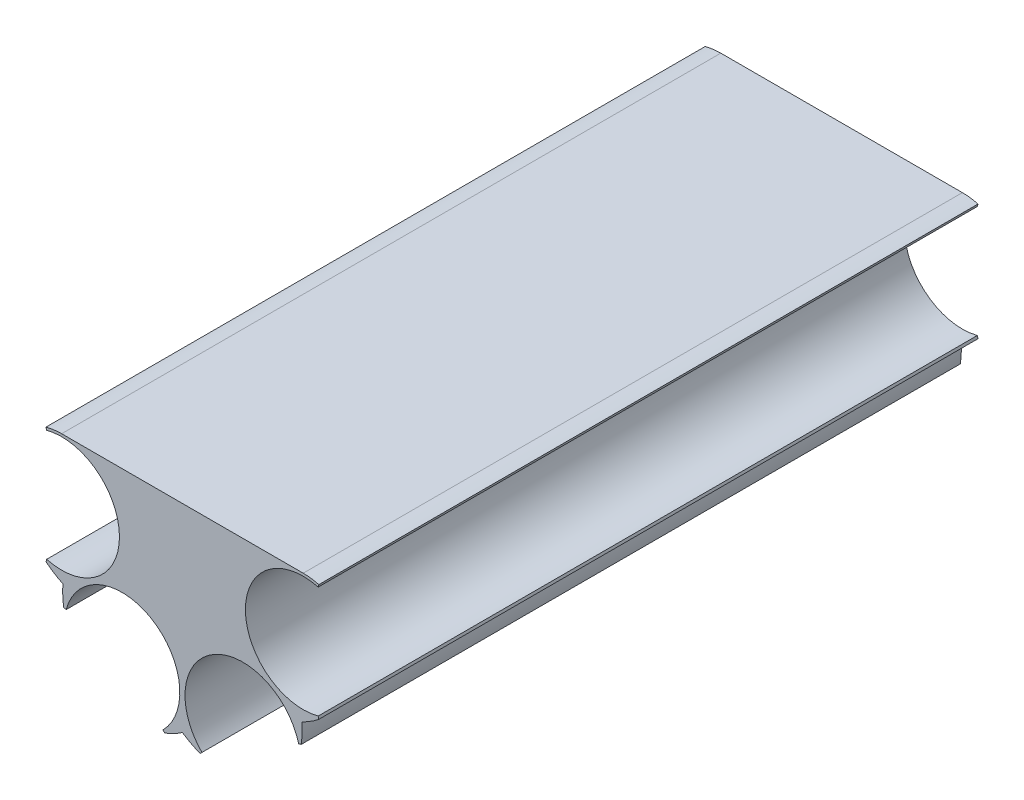
ISO-10303-21;
HEADER;
FILE_DESCRIPTION(('STEP AP214'),'2;1');
FILE_NAME('part.step','',(''),(''),'','','');
FILE_SCHEMA(('AUTOMOTIVE_DESIGN { 1 0 10303 214 1 1 1 1 }'));
ENDSEC;
DATA;
#1=APPLICATION_CONTEXT('core data for automotive mechanical design processes');
#2=APPLICATION_PROTOCOL_DEFINITION('international standard','automotive_design',2000,#1);
#3=PRODUCT_CONTEXT('',#1,'mechanical');
#4=PRODUCT('Part','Part','',(#3));
#5=PRODUCT_RELATED_PRODUCT_CATEGORY('part','',(#4));
#6=PRODUCT_DEFINITION_FORMATION('','',#4);
#7=PRODUCT_DEFINITION_CONTEXT('part definition',#1,'design');
#8=PRODUCT_DEFINITION('design','',#6,#7);
#9=PRODUCT_DEFINITION_SHAPE('','',#8);
#10=(LENGTH_UNIT() NAMED_UNIT(*) SI_UNIT(.MILLI.,.METRE.));
#11=(NAMED_UNIT(*) PLANE_ANGLE_UNIT() SI_UNIT($,.RADIAN.));
#12=(NAMED_UNIT(*) SI_UNIT($,.STERADIAN.) SOLID_ANGLE_UNIT());
#13=UNCERTAINTY_MEASURE_WITH_UNIT(LENGTH_MEASURE(1.E-05),#10,'distance_accuracy_value','');
#14=(GEOMETRIC_REPRESENTATION_CONTEXT(3) GLOBAL_UNCERTAINTY_ASSIGNED_CONTEXT((#13)) GLOBAL_UNIT_ASSIGNED_CONTEXT((#10,
#11,#12)) REPRESENTATION_CONTEXT('',''));
#15=CARTESIAN_POINT('',(0.,0.,0.));
#16=DIRECTION('',(0.,0.,1.));
#17=DIRECTION('',(1.,0.,0.));
#18=AXIS2_PLACEMENT_3D('',#15,#16,#17);
#19=CARTESIAN_POINT('',(-35.,0.,191.));
#20=DIRECTION('',(0.,0.,-1.));
#21=DIRECTION('',(-1.,0.,0.));
#22=AXIS2_PLACEMENT_3D('',#19,#20,#21);
#23=CYLINDRICAL_SURFACE('',#22,16.75);
#24=CARTESIAN_POINT('',(-35.,0.,0.));
#25=DIRECTION('',(0.,0.,-1.));
#26=DIRECTION('',(-1.,0.,0.));
#27=AXIS2_PLACEMENT_3D('',#24,#25,#26);
#28=CIRCLE('',#27,16.75);
#29=CARTESIAN_POINT('',(-39.3352190054672,16.1792575903419,0.));
#30=VERTEX_POINT('',#29);
#31=CARTESIAN_POINT('',(-39.3352190054672,-16.1792575903419,0.));
#32=VERTEX_POINT('',#31);
#33=EDGE_CURVE('E211',#30,#32,#28,.T.);
#34=ORIENTED_EDGE('',*,*,#33,.T.);
#35=DIRECTION('',(0.,0.,-1.));
#36=VECTOR('',#35,1.);
#37=CARTESIAN_POINT('',(-39.3352190054672,-16.1792575903419,191.));
#38=LINE('',#37,#36);
#39=CARTESIAN_POINT('',(-39.3352190054672,-16.1792575903419,191.));
#40=VERTEX_POINT('',#39);
#41=EDGE_CURVE('E11',#40,#32,#38,.T.);
#42=ORIENTED_EDGE('',*,*,#41,.F.);
#43=CARTESIAN_POINT('',(-35.,0.,191.));
#44=DIRECTION('',(0.,0.,-1.));
#45=DIRECTION('',(-1.,0.,0.));
#46=AXIS2_PLACEMENT_3D('',#43,#44,#45);
#47=CIRCLE('',#46,16.75);
#48=CARTESIAN_POINT('',(-39.3352190054672,16.1792575903419,191.));
#49=VERTEX_POINT('',#48);
#50=EDGE_CURVE('E251',#49,#40,#47,.T.);
#51=ORIENTED_EDGE('',*,*,#50,.F.);
#52=DIRECTION('',(0.,0.,-1.));
#53=VECTOR('',#52,1.);
#54=CARTESIAN_POINT('',(-39.3352190054672,16.1792575903419,191.));
#55=LINE('',#54,#53);
#56=EDGE_CURVE('E207',#49,#30,#55,.T.);
#57=ORIENTED_EDGE('',*,*,#56,.T.);
#58=EDGE_LOOP('',(#34,#42,#51,#57));
#59=FACE_BOUND('',#58,.T.);
#60=ADVANCED_FACE('F37',(#59),#23,.F.);
#61=CARTESIAN_POINT('',(-39.5293332892941,-16.9037019600587,191.));
#62=DIRECTION('',(0.965925826289069,-0.258819045102517,0.));
#63=DIRECTION('',(0.258819045102517,0.965925826289069,0.));
#64=AXIS2_PLACEMENT_3D('',#61,#62,#63);
#65=PLANE('',#64);
#66=DIRECTION('',(-0.258819045102517,-0.965925826289069,0.));
#67=VECTOR('',#66,1.);
#68=CARTESIAN_POINT('',(-39.5293332892941,-16.9037019600587,0.));
#69=LINE('',#68,#67);
#70=CARTESIAN_POINT('',(-39.5293332892941,-16.9037019600587,0.));
#71=VERTEX_POINT('',#70);
#72=EDGE_CURVE('E214',#32,#71,#69,.T.);
#73=ORIENTED_EDGE('',*,*,#72,.T.);
#74=DIRECTION('',(0.,0.,-1.));
#75=VECTOR('',#74,1.);
#76=CARTESIAN_POINT('',(-39.5293332892941,-16.9037019600587,191.));
#77=LINE('',#76,#75);
#78=CARTESIAN_POINT('',(-39.5293332892941,-16.9037019600587,191.));
#79=VERTEX_POINT('',#78);
#80=EDGE_CURVE('E45',#79,#71,#77,.T.);
#81=ORIENTED_EDGE('',*,*,#80,.F.);
#82=DIRECTION('',(-0.258819045102517,-0.965925826289069,0.));
#83=VECTOR('',#82,1.);
#84=CARTESIAN_POINT('',(-39.5293332892941,-16.9037019600587,191.));
#85=LINE('',#84,#83);
#86=EDGE_CURVE('E135',#40,#79,#85,.T.);
#87=ORIENTED_EDGE('',*,*,#86,.F.);
#88=ORIENTED_EDGE('',*,*,#41,.T.);
#89=EDGE_LOOP('',(#73,#81,#87,#88));
#90=FACE_BOUND('',#89,.T.);
#91=ADVANCED_FACE('F374',(#90),#65,.F.);
#92=CARTESIAN_POINT('',(-23.8162097704473,2.54103381293305,191.));
#93=DIRECTION('',(0.,0.,-1.));
#94=DIRECTION('',(-1.,0.,0.));
#95=AXIS2_PLACEMENT_3D('',#92,#93,#94);
#96=CYLINDRICAL_SURFACE('',#95,25.);
#97=CARTESIAN_POINT('',(-23.8162097704473,2.54103381293305,0.));
#98=DIRECTION('',(0.,0.,1.));
#99=DIRECTION('',(1.,0.,0.));
#100=AXIS2_PLACEMENT_3D('',#97,#98,#99);
#101=CIRCLE('',#100,25.);
#102=CARTESIAN_POINT('',(-34.6352549156242,-19.996673748987,0.));
#103=VERTEX_POINT('',#102);
#104=EDGE_CURVE('E216',#71,#103,#101,.T.);
#105=ORIENTED_EDGE('',*,*,#104,.T.);
#106=DIRECTION('',(0.,0.,-1.));
#107=VECTOR('',#106,1.);
#108=CARTESIAN_POINT('',(-34.6352549156242,-19.996673748987,191.));
#109=LINE('',#108,#107);
#110=CARTESIAN_POINT('',(-34.6352549156242,-19.996673748987,191.));
#111=VERTEX_POINT('',#110);
#112=EDGE_CURVE('E297',#111,#103,#109,.T.);
#113=ORIENTED_EDGE('',*,*,#112,.F.);
#114=CARTESIAN_POINT('',(-23.8162097704473,2.54103381293305,191.));
#115=DIRECTION('',(0.,0.,1.));
#116=DIRECTION('',(1.,0.,0.));
#117=AXIS2_PLACEMENT_3D('',#114,#115,#116);
#118=CIRCLE('',#117,25.);
#119=EDGE_CURVE('E305',#79,#111,#118,.T.);
#120=ORIENTED_EDGE('',*,*,#119,.F.);
#121=ORIENTED_EDGE('',*,*,#80,.T.);
#122=EDGE_LOOP('',(#105,#113,#120,#121));
#123=FACE_BOUND('',#122,.T.);
#124=ADVANCED_FACE('F303',(#123),#96,.T.);
#125=CARTESIAN_POINT('',(-9.7075050513484,-21.8959595895331,191.));
#126=DIRECTION('',(0.,0.,-1.));
#127=DIRECTION('',(-1.,0.,0.));
#128=AXIS2_PLACEMENT_3D('',#125,#126,#127);
#129=CYLINDRICAL_SURFACE('',#128,25.);
#130=CARTESIAN_POINT('',(-9.7075050513484,-21.8959595895331,0.));
#131=DIRECTION('',(0.,0.,1.));
#132=DIRECTION('',(-1.,0.,0.));
#133=AXIS2_PLACEMENT_3D('',#130,#131,#132);
#134=CIRCLE('',#133,25.);
#135=CARTESIAN_POINT('',(-34.4037019600587,-25.7815558431613,0.));
#136=VERTEX_POINT('',#135);
#137=EDGE_CURVE('E218',#103,#136,#134,.T.);
#138=ORIENTED_EDGE('',*,*,#137,.T.);
#139=DIRECTION('',(0.,0.,-1.));
#140=VECTOR('',#139,1.);
#141=CARTESIAN_POINT('',(-34.4037019600587,-25.7815558431613,191.));
#142=LINE('',#141,#140);
#143=CARTESIAN_POINT('',(-34.4037019600587,-25.7815558431613,191.));
#144=VERTEX_POINT('',#143);
#145=EDGE_CURVE('E294',#144,#136,#142,.T.);
#146=ORIENTED_EDGE('',*,*,#145,.F.);
#147=CARTESIAN_POINT('',(-9.7075050513484,-21.8959595895331,191.));
#148=DIRECTION('',(0.,0.,1.));
#149=DIRECTION('',(-1.,0.,0.));
#150=AXIS2_PLACEMENT_3D('',#147,#148,#149);
#151=CIRCLE('',#150,25.);
#152=EDGE_CURVE('E323',#111,#144,#151,.T.);
#153=ORIENTED_EDGE('',*,*,#152,.F.);
#154=ORIENTED_EDGE('',*,*,#112,.T.);
#155=EDGE_LOOP('',(#138,#146,#153,#154));
#156=FACE_BOUND('',#155,.T.);
#157=ADVANCED_FACE('F314',(#156),#129,.T.);
#158=CARTESIAN_POINT('',(-34.4037019600587,-25.7815558431613,191.));
#159=DIRECTION('',(0.258819045102511,0.965925826289071,0.));
#160=DIRECTION('',(-0.965925826289071,0.258819045102511,0.));
#161=AXIS2_PLACEMENT_3D('',#158,#159,#160);
#162=PLANE('',#161);
#163=DIRECTION('',(0.965925826289071,-0.258819045102511,0.));
#164=VECTOR('',#163,1.);
#165=CARTESIAN_POINT('',(-34.4037019600587,-25.7815558431613,0.));
#166=LINE('',#165,#164);
#167=CARTESIAN_POINT('',(-33.6792575903418,-25.9756701269881,0.));
#168=VERTEX_POINT('',#167);
#169=EDGE_CURVE('E220',#136,#168,#166,.T.);
#170=ORIENTED_EDGE('',*,*,#169,.T.);
#171=DIRECTION('',(0.,0.,-1.));
#172=VECTOR('',#171,1.);
#173=CARTESIAN_POINT('',(-33.6792575903418,-25.9756701269881,191.));
#174=LINE('',#173,#172);
#175=CARTESIAN_POINT('',(-33.6792575903418,-25.9756701269881,191.));
#176=VERTEX_POINT('',#175);
#177=EDGE_CURVE('E291',#176,#168,#174,.T.);
#178=ORIENTED_EDGE('',*,*,#177,.F.);
#179=DIRECTION('',(0.965925826289071,-0.258819045102511,0.));
#180=VECTOR('',#179,1.);
#181=CARTESIAN_POINT('',(-34.4037019600587,-25.7815558431613,191.));
#182=LINE('',#181,#180);
#183=EDGE_CURVE('E320',#144,#176,#182,.T.);
#184=ORIENTED_EDGE('',*,*,#183,.F.);
#185=ORIENTED_EDGE('',*,*,#145,.T.);
#186=EDGE_LOOP('',(#170,#178,#184,#185));
#187=FACE_BOUND('',#186,.T.);
#188=ADVANCED_FACE('F318',(#187),#162,.F.);
#189=CARTESIAN_POINT('',(-17.4999999999999,-30.3108891324554,191.));
#190=DIRECTION('',(0.,0.,-1.));
#191=DIRECTION('',(-1.,0.,0.));
#192=AXIS2_PLACEMENT_3D('',#189,#190,#191);
#193=CYLINDRICAL_SURFACE('',#192,16.75);
#194=CARTESIAN_POINT('',(-17.4999999999999,-30.3108891324554,0.));
#195=DIRECTION('',(0.,0.,-1.));
#196=DIRECTION('',(-1.,0.,0.));
#197=AXIS2_PLACEMENT_3D('',#194,#195,#196);
#198=CIRCLE('',#197,16.75);
#199=CARTESIAN_POINT('',(-5.65596141512532,-42.15492771733,0.));
#200=VERTEX_POINT('',#199);
#201=EDGE_CURVE('E222',#168,#200,#198,.T.);
#202=ORIENTED_EDGE('',*,*,#201,.T.);
#203=DIRECTION('',(0.,0.,-1.));
#204=VECTOR('',#203,1.);
#205=CARTESIAN_POINT('',(-5.65596141512532,-42.15492771733,191.));
#206=LINE('',#205,#204);
#207=CARTESIAN_POINT('',(-5.65596141512532,-42.15492771733,191.));
#208=VERTEX_POINT('',#207);
#209=EDGE_CURVE('E288',#208,#200,#206,.T.);
#210=ORIENTED_EDGE('',*,*,#209,.F.);
#211=CARTESIAN_POINT('',(-17.4999999999999,-30.3108891324554,191.));
#212=DIRECTION('',(0.,0.,-1.));
#213=DIRECTION('',(-1.,0.,0.));
#214=AXIS2_PLACEMENT_3D('',#211,#212,#213);
#215=CIRCLE('',#214,16.75);
#216=EDGE_CURVE('E322',#176,#208,#215,.T.);
#217=ORIENTED_EDGE('',*,*,#216,.F.);
#218=ORIENTED_EDGE('',*,*,#177,.T.);
#219=EDGE_LOOP('',(#202,#210,#217,#218));
#220=FACE_BOUND('',#219,.T.);
#221=ADVANCED_FACE('F387',(#220),#193,.F.);
#222=CARTESIAN_POINT('',(-5.12563132923541,-42.6852578032199,191.));
#223=DIRECTION('',(0.707106781186542,0.707106781186553,0.));
#224=DIRECTION('',(-0.707106781186553,0.707106781186542,0.));
#225=AXIS2_PLACEMENT_3D('',#222,#223,#224);
#226=PLANE('',#225);
#227=DIRECTION('',(0.707106781186553,-0.707106781186542,0.));
#228=VECTOR('',#227,1.);
#229=CARTESIAN_POINT('',(-5.12563132923541,-42.6852578032199,0.));
#230=LINE('',#229,#228);
#231=CARTESIAN_POINT('',(-5.12563132923539,-42.68525780322,0.));
#232=VERTEX_POINT('',#231);
#233=EDGE_CURVE('E224',#200,#232,#230,.T.);
#234=ORIENTED_EDGE('',*,*,#233,.T.);
#235=DIRECTION('',(0.,0.,-1.));
#236=VECTOR('',#235,1.);
#237=CARTESIAN_POINT('',(-5.12563132923539,-42.68525780322,191.));
#238=LINE('',#237,#236);
#239=CARTESIAN_POINT('',(-5.12563132923539,-42.68525780322,191.));
#240=VERTEX_POINT('',#239);
#241=EDGE_CURVE('E285',#240,#232,#238,.T.);
#242=ORIENTED_EDGE('',*,*,#241,.F.);
#243=DIRECTION('',(0.707106781186553,-0.707106781186542,0.));
#244=VECTOR('',#243,1.);
#245=CARTESIAN_POINT('',(-5.12563132923541,-42.6852578032199,191.));
#246=LINE('',#245,#244);
#247=EDGE_CURVE('E325',#208,#240,#246,.T.);
#248=ORIENTED_EDGE('',*,*,#247,.F.);
#249=ORIENTED_EDGE('',*,*,#209,.T.);
#250=EDGE_LOOP('',(#234,#242,#248,#249));
#251=FACE_BOUND('',#250,.T.);
#252=ADVANCED_FACE('F390',(#251),#226,.F.);
#253=CARTESIAN_POINT('',(-14.1087047190989,-19.3549257766,191.));
#254=DIRECTION('',(0.,0.,-1.));
#255=DIRECTION('',(-1.,0.,0.));
#256=AXIS2_PLACEMENT_3D('',#253,#254,#255);
#257=CYLINDRICAL_SURFACE('',#256,25.);
#258=CARTESIAN_POINT('',(-14.1087047190989,-19.3549257766,0.));
#259=DIRECTION('',(0.,0.,1.));
#260=DIRECTION('',(1.,0.,0.));
#261=AXIS2_PLACEMENT_3D('',#258,#259,#260);
#262=CIRCLE('',#261,25.);
#263=CARTESIAN_POINT('',(0.,-39.9933474979739,0.));
#264=VERTEX_POINT('',#263);
#265=EDGE_CURVE('E226',#232,#264,#262,.T.);
#266=ORIENTED_EDGE('',*,*,#265,.T.);
#267=DIRECTION('',(0.,0.,-1.));
#268=VECTOR('',#267,1.);
#269=CARTESIAN_POINT('',(0.,-39.9933474979739,191.));
#270=LINE('',#269,#268);
#271=CARTESIAN_POINT('',(0.,-39.9933474979739,191.));
#272=VERTEX_POINT('',#271);
#273=EDGE_CURVE('E282',#272,#264,#270,.T.);
#274=ORIENTED_EDGE('',*,*,#273,.F.);
#275=CARTESIAN_POINT('',(-14.1087047190989,-19.3549257766,191.));
#276=DIRECTION('',(0.,0.,1.));
#277=DIRECTION('',(1.,0.,0.));
#278=AXIS2_PLACEMENT_3D('',#275,#276,#277);
#279=CIRCLE('',#278,25.);
#280=EDGE_CURVE('E331',#240,#272,#279,.T.);
#281=ORIENTED_EDGE('',*,*,#280,.F.);
#282=ORIENTED_EDGE('',*,*,#241,.T.);
#283=EDGE_LOOP('',(#266,#274,#281,#282));
#284=FACE_BOUND('',#283,.T.);
#285=ADVANCED_FACE('F394',(#284),#257,.T.);
#286=CARTESIAN_POINT('',(14.1087047190989,-19.3549257766,191.));
#287=DIRECTION('',(0.,0.,-1.));
#288=DIRECTION('',(-1.,0.,0.));
#289=AXIS2_PLACEMENT_3D('',#286,#287,#288);
#290=CYLINDRICAL_SURFACE('',#289,25.);
#291=CARTESIAN_POINT('',(14.1087047190989,-19.3549257766,0.));
#292=DIRECTION('',(0.,0.,1.));
#293=DIRECTION('',(-1.,0.,0.));
#294=AXIS2_PLACEMENT_3D('',#291,#292,#293);
#295=CIRCLE('',#294,25.);
#296=CARTESIAN_POINT('',(5.12563132923542,-42.6852578032199,0.));
#297=VERTEX_POINT('',#296);
#298=EDGE_CURVE('E228',#264,#297,#295,.T.);
#299=ORIENTED_EDGE('',*,*,#298,.T.);
#300=DIRECTION('',(0.,0.,-1.));
#301=VECTOR('',#300,1.);
#302=CARTESIAN_POINT('',(5.12563132923542,-42.6852578032199,191.));
#303=LINE('',#302,#301);
#304=CARTESIAN_POINT('',(5.12563132923542,-42.6852578032199,191.));
#305=VERTEX_POINT('',#304);
#306=EDGE_CURVE('E279',#305,#297,#303,.T.);
#307=ORIENTED_EDGE('',*,*,#306,.F.);
#308=CARTESIAN_POINT('',(14.1087047190989,-19.3549257766,191.));
#309=DIRECTION('',(0.,0.,1.));
#310=DIRECTION('',(-1.,0.,0.));
#311=AXIS2_PLACEMENT_3D('',#308,#309,#310);
#312=CIRCLE('',#311,25.);
#313=EDGE_CURVE('E333',#272,#305,#312,.T.);
#314=ORIENTED_EDGE('',*,*,#313,.F.);
#315=ORIENTED_EDGE('',*,*,#273,.T.);
#316=EDGE_LOOP('',(#299,#307,#314,#315));
#317=FACE_BOUND('',#316,.T.);
#318=ADVANCED_FACE('F398',(#317),#290,.T.);
#319=CARTESIAN_POINT('',(5.12563132923542,-42.6852578032199,191.));
#320=DIRECTION('',(-0.707106781186547,0.707106781186547,0.));
#321=DIRECTION('',(-0.707106781186548,-0.707106781186548,0.));
#322=AXIS2_PLACEMENT_3D('',#319,#320,#321);
#323=PLANE('',#322);
#324=DIRECTION('',(0.707106781186547,0.707106781186547,0.));
#325=VECTOR('',#324,1.);
#326=CARTESIAN_POINT('',(5.12563132923542,-42.6852578032199,0.));
#327=LINE('',#326,#325);
#328=CARTESIAN_POINT('',(5.65596141512534,-42.15492771733,0.));
#329=VERTEX_POINT('',#328);
#330=EDGE_CURVE('E230',#297,#329,#327,.T.);
#331=ORIENTED_EDGE('',*,*,#330,.T.);
#332=DIRECTION('',(0.,0.,-1.));
#333=VECTOR('',#332,1.);
#334=CARTESIAN_POINT('',(5.65596141512534,-42.15492771733,191.));
#335=LINE('',#334,#333);
#336=CARTESIAN_POINT('',(5.65596141512534,-42.15492771733,191.));
#337=VERTEX_POINT('',#336);
#338=EDGE_CURVE('E276',#337,#329,#335,.T.);
#339=ORIENTED_EDGE('',*,*,#338,.F.);
#340=DIRECTION('',(0.707106781186547,0.707106781186547,0.));
#341=VECTOR('',#340,1.);
#342=CARTESIAN_POINT('',(5.12563132923542,-42.6852578032199,191.));
#343=LINE('',#342,#341);
#344=EDGE_CURVE('E335',#305,#337,#343,.T.);
#345=ORIENTED_EDGE('',*,*,#344,.F.);
#346=ORIENTED_EDGE('',*,*,#306,.T.);
#347=EDGE_LOOP('',(#331,#339,#345,#346));
#348=FACE_BOUND('',#347,.T.);
#349=ADVANCED_FACE('F402',(#348),#323,.F.);
#350=CARTESIAN_POINT('',(17.5,-30.3108891324553,191.));
#351=DIRECTION('',(0.,0.,-1.));
#352=DIRECTION('',(-1.,0.,0.));
#353=AXIS2_PLACEMENT_3D('',#350,#351,#352);
#354=CYLINDRICAL_SURFACE('',#353,16.75);
#355=CARTESIAN_POINT('',(17.5,-30.3108891324553,0.));
#356=DIRECTION('',(0.,0.,-1.));
#357=DIRECTION('',(-1.,0.,0.));
#358=AXIS2_PLACEMENT_3D('',#355,#356,#357);
#359=CIRCLE('',#358,16.75);
#360=CARTESIAN_POINT('',(33.6792575903419,-25.9756701269881,0.));
#361=VERTEX_POINT('',#360);
#362=EDGE_CURVE('E232',#329,#361,#359,.T.);
#363=ORIENTED_EDGE('',*,*,#362,.T.);
#364=DIRECTION('',(0.,0.,-1.));
#365=VECTOR('',#364,1.);
#366=CARTESIAN_POINT('',(33.6792575903419,-25.9756701269881,191.));
#367=LINE('',#366,#365);
#368=CARTESIAN_POINT('',(33.6792575903419,-25.9756701269881,191.));
#369=VERTEX_POINT('',#368);
#370=EDGE_CURVE('E273',#369,#361,#367,.T.);
#371=ORIENTED_EDGE('',*,*,#370,.F.);
#372=CARTESIAN_POINT('',(17.5,-30.3108891324553,191.));
#373=DIRECTION('',(0.,0.,-1.));
#374=DIRECTION('',(-1.,0.,0.));
#375=AXIS2_PLACEMENT_3D('',#372,#373,#374);
#376=CIRCLE('',#375,16.75);
#377=EDGE_CURVE('E337',#337,#369,#376,.T.);
#378=ORIENTED_EDGE('',*,*,#377,.F.);
#379=ORIENTED_EDGE('',*,*,#338,.T.);
#380=EDGE_LOOP('',(#363,#371,#378,#379));
#381=FACE_BOUND('',#380,.T.);
#382=ADVANCED_FACE('F406',(#381),#354,.F.);
#383=CARTESIAN_POINT('',(34.4037019600587,-25.7815558431612,191.));
#384=DIRECTION('',(-0.258819045102525,0.965925826289067,0.));
#385=DIRECTION('',(-0.965925826289067,-0.258819045102525,0.));
#386=AXIS2_PLACEMENT_3D('',#383,#384,#385);
#387=PLANE('',#386);
#388=DIRECTION('',(0.965925826289067,0.258819045102525,0.));
#389=VECTOR('',#388,1.);
#390=CARTESIAN_POINT('',(34.4037019600587,-25.7815558431612,0.));
#391=LINE('',#390,#389);
#392=CARTESIAN_POINT('',(34.4037019600588,-25.7815558431612,0.));
#393=VERTEX_POINT('',#392);
#394=EDGE_CURVE('E234',#361,#393,#391,.T.);
#395=ORIENTED_EDGE('',*,*,#394,.T.);
#396=DIRECTION('',(0.,0.,-1.));
#397=VECTOR('',#396,1.);
#398=CARTESIAN_POINT('',(34.4037019600588,-25.7815558431612,191.));
#399=LINE('',#398,#397);
#400=CARTESIAN_POINT('',(34.4037019600588,-25.7815558431612,191.));
#401=VERTEX_POINT('',#400);
#402=EDGE_CURVE('E270',#401,#393,#399,.T.);
#403=ORIENTED_EDGE('',*,*,#402,.F.);
#404=DIRECTION('',(0.965925826289067,0.258819045102525,0.));
#405=VECTOR('',#404,1.);
#406=CARTESIAN_POINT('',(34.4037019600587,-25.7815558431612,191.));
#407=LINE('',#406,#405);
#408=EDGE_CURVE('E339',#369,#401,#407,.T.);
#409=ORIENTED_EDGE('',*,*,#408,.F.);
#410=ORIENTED_EDGE('',*,*,#370,.T.);
#411=EDGE_LOOP('',(#395,#403,#409,#410));
#412=FACE_BOUND('',#411,.T.);
#413=ADVANCED_FACE('F410',(#412),#387,.F.);
#414=CARTESIAN_POINT('',(9.70750505134842,-21.8959595895331,191.));
#415=DIRECTION('',(0.,0.,-1.));
#416=DIRECTION('',(-1.,0.,0.));
#417=AXIS2_PLACEMENT_3D('',#414,#415,#416);
#418=CYLINDRICAL_SURFACE('',#417,25.0000000000001);
#419=CARTESIAN_POINT('',(9.70750505134842,-21.8959595895331,0.));
#420=DIRECTION('',(0.,0.,1.));
#421=DIRECTION('',(1.,0.,0.));
#422=AXIS2_PLACEMENT_3D('',#419,#420,#421);
#423=CIRCLE('',#422,25.0000000000001);
#424=CARTESIAN_POINT('',(34.6352549156243,-19.9966737489868,0.));
#425=VERTEX_POINT('',#424);
#426=EDGE_CURVE('E236',#393,#425,#423,.T.);
#427=ORIENTED_EDGE('',*,*,#426,.T.);
#428=DIRECTION('',(0.,0.,-1.));
#429=VECTOR('',#428,1.);
#430=CARTESIAN_POINT('',(34.6352549156243,-19.9966737489868,191.));
#431=LINE('',#430,#429);
#432=CARTESIAN_POINT('',(34.6352549156243,-19.9966737489868,191.));
#433=VERTEX_POINT('',#432);
#434=EDGE_CURVE('E267',#433,#425,#431,.T.);
#435=ORIENTED_EDGE('',*,*,#434,.F.);
#436=CARTESIAN_POINT('',(9.70750505134842,-21.8959595895331,191.));
#437=DIRECTION('',(0.,0.,1.));
#438=DIRECTION('',(1.,0.,0.));
#439=AXIS2_PLACEMENT_3D('',#436,#437,#438);
#440=CIRCLE('',#439,25.0000000000001);
#441=EDGE_CURVE('E341',#401,#433,#440,.T.);
#442=ORIENTED_EDGE('',*,*,#441,.F.);
#443=ORIENTED_EDGE('',*,*,#402,.T.);
#444=EDGE_LOOP('',(#427,#435,#442,#443));
#445=FACE_BOUND('',#444,.T.);
#446=ADVANCED_FACE('F414',(#445),#418,.T.);
#447=CARTESIAN_POINT('',(23.8162097704473,2.54103381293306,191.));
#448=DIRECTION('',(0.,0.,-1.));
#449=DIRECTION('',(-1.,0.,0.));
#450=AXIS2_PLACEMENT_3D('',#447,#448,#449);
#451=CYLINDRICAL_SURFACE('',#450,25.);
#452=CARTESIAN_POINT('',(23.8162097704473,2.54103381293306,0.));
#453=DIRECTION('',(0.,0.,1.));
#454=DIRECTION('',(-1.,0.,0.));
#455=AXIS2_PLACEMENT_3D('',#452,#453,#454);
#456=CIRCLE('',#455,25.);
#457=CARTESIAN_POINT('',(39.5293332892941,-16.9037019600587,0.));
#458=VERTEX_POINT('',#457);
#459=EDGE_CURVE('E238',#425,#458,#456,.T.);
#460=ORIENTED_EDGE('',*,*,#459,.T.);
#461=DIRECTION('',(0.,0.,-1.));
#462=VECTOR('',#461,1.);
#463=CARTESIAN_POINT('',(39.5293332892941,-16.9037019600587,191.));
#464=LINE('',#463,#462);
#465=CARTESIAN_POINT('',(39.5293332892941,-16.9037019600587,191.));
#466=VERTEX_POINT('',#465);
#467=EDGE_CURVE('E264',#466,#458,#464,.T.);
#468=ORIENTED_EDGE('',*,*,#467,.F.);
#469=CARTESIAN_POINT('',(23.8162097704473,2.54103381293306,191.));
#470=DIRECTION('',(0.,0.,1.));
#471=DIRECTION('',(-1.,0.,0.));
#472=AXIS2_PLACEMENT_3D('',#469,#470,#471);
#473=CIRCLE('',#472,25.);
#474=EDGE_CURVE('E343',#433,#466,#473,.T.);
#475=ORIENTED_EDGE('',*,*,#474,.F.);
#476=ORIENTED_EDGE('',*,*,#434,.T.);
#477=EDGE_LOOP('',(#460,#468,#475,#476));
#478=FACE_BOUND('',#477,.T.);
#479=ADVANCED_FACE('F418',(#478),#451,.T.);
#480=CARTESIAN_POINT('',(39.5293332892941,-16.9037019600587,191.));
#481=DIRECTION('',(-0.965925826289065,-0.258819045102533,0.));
#482=DIRECTION('',(0.258819045102533,-0.965925826289065,0.));
#483=AXIS2_PLACEMENT_3D('',#480,#481,#482);
#484=PLANE('',#483);
#485=DIRECTION('',(-0.258819045102533,0.965925826289065,0.));
#486=VECTOR('',#485,1.);
#487=CARTESIAN_POINT('',(39.5293332892941,-16.9037019600587,0.));
#488=LINE('',#487,#486);
#489=CARTESIAN_POINT('',(39.3352190054672,-16.1792575903419,0.));
#490=VERTEX_POINT('',#489);
#491=EDGE_CURVE('E240',#458,#490,#488,.T.);
#492=ORIENTED_EDGE('',*,*,#491,.T.);
#493=DIRECTION('',(0.,0.,-1.));
#494=VECTOR('',#493,1.);
#495=CARTESIAN_POINT('',(39.3352190054672,-16.1792575903419,191.));
#496=LINE('',#495,#494);
#497=CARTESIAN_POINT('',(39.3352190054672,-16.1792575903419,191.));
#498=VERTEX_POINT('',#497);
#499=EDGE_CURVE('E261',#498,#490,#496,.T.);
#500=ORIENTED_EDGE('',*,*,#499,.F.);
#501=DIRECTION('',(-0.258819045102533,0.965925826289065,0.));
#502=VECTOR('',#501,1.);
#503=CARTESIAN_POINT('',(39.5293332892941,-16.9037019600587,191.));
#504=LINE('',#503,#502);
#505=EDGE_CURVE('E345',#466,#498,#504,.T.);
#506=ORIENTED_EDGE('',*,*,#505,.F.);
#507=ORIENTED_EDGE('',*,*,#467,.T.);
#508=EDGE_LOOP('',(#492,#500,#506,#507));
#509=FACE_BOUND('',#508,.T.);
#510=ADVANCED_FACE('F422',(#509),#484,.F.);
#511=CARTESIAN_POINT('',(35.,0.,191.));
#512=DIRECTION('',(0.,0.,-1.));
#513=DIRECTION('',(-1.,0.,0.));
#514=AXIS2_PLACEMENT_3D('',#511,#512,#513);
#515=CYLINDRICAL_SURFACE('',#514,16.75);
#516=CARTESIAN_POINT('',(35.,0.,0.));
#517=DIRECTION('',(0.,0.,-1.));
#518=DIRECTION('',(-1.,0.,0.));
#519=AXIS2_PLACEMENT_3D('',#516,#517,#518);
#520=CIRCLE('',#519,16.75);
#521=CARTESIAN_POINT('',(39.3352190054672,16.1792575903419,0.));
#522=VERTEX_POINT('',#521);
#523=EDGE_CURVE('E242',#490,#522,#520,.T.);
#524=ORIENTED_EDGE('',*,*,#523,.T.);
#525=DIRECTION('',(0.,0.,-1.));
#526=VECTOR('',#525,1.);
#527=CARTESIAN_POINT('',(39.3352190054672,16.1792575903419,191.));
#528=LINE('',#527,#526);
#529=CARTESIAN_POINT('',(39.3352190054672,16.1792575903419,191.));
#530=VERTEX_POINT('',#529);
#531=EDGE_CURVE('E258',#530,#522,#528,.T.);
#532=ORIENTED_EDGE('',*,*,#531,.F.);
#533=CARTESIAN_POINT('',(35.,0.,191.));
#534=DIRECTION('',(0.,0.,-1.));
#535=DIRECTION('',(-1.,0.,0.));
#536=AXIS2_PLACEMENT_3D('',#533,#534,#535);
#537=CIRCLE('',#536,16.75);
#538=EDGE_CURVE('E347',#498,#530,#537,.T.);
#539=ORIENTED_EDGE('',*,*,#538,.F.);
#540=ORIENTED_EDGE('',*,*,#499,.T.);
#541=EDGE_LOOP('',(#524,#532,#539,#540));
#542=FACE_BOUND('',#541,.T.);
#543=ADVANCED_FACE('F426',(#542),#515,.F.);
#544=CARTESIAN_POINT('',(39.5293332892941,16.9037019600587,191.));
#545=DIRECTION('',(-0.965925826289066,0.258819045102529,0.));
#546=DIRECTION('',(-0.258819045102529,-0.965925826289066,0.));
#547=AXIS2_PLACEMENT_3D('',#544,#545,#546);
#548=PLANE('',#547);
#549=DIRECTION('',(0.258819045102529,0.965925826289066,0.));
#550=VECTOR('',#549,1.);
#551=CARTESIAN_POINT('',(39.5293332892941,16.9037019600587,0.));
#552=LINE('',#551,#550);
#553=CARTESIAN_POINT('',(39.5293332892941,16.9037019600587,0.));
#554=VERTEX_POINT('',#553);
#555=EDGE_CURVE('E244',#522,#554,#552,.T.);
#556=ORIENTED_EDGE('',*,*,#555,.T.);
#557=DIRECTION('',(0.,0.,-1.));
#558=VECTOR('',#557,1.);
#559=CARTESIAN_POINT('',(39.5293332892941,16.9037019600587,191.));
#560=LINE('',#559,#558);
#561=CARTESIAN_POINT('',(39.5293332892941,16.9037019600587,191.));
#562=VERTEX_POINT('',#561);
#563=EDGE_CURVE('E255',#562,#554,#560,.T.);
#564=ORIENTED_EDGE('',*,*,#563,.F.);
#565=DIRECTION('',(0.258819045102529,0.965925826289066,0.));
#566=VECTOR('',#565,1.);
#567=CARTESIAN_POINT('',(39.5293332892941,16.9037019600587,191.));
#568=LINE('',#567,#566);
#569=EDGE_CURVE('E349',#530,#562,#568,.T.);
#570=ORIENTED_EDGE('',*,*,#569,.F.);
#571=ORIENTED_EDGE('',*,*,#531,.T.);
#572=EDGE_LOOP('',(#556,#564,#570,#571));
#573=FACE_BOUND('',#572,.T.);
#574=ADVANCED_FACE('F355',(#573),#548,.F.);
#575=CARTESIAN_POINT('',(35.,0.,191.));
#576=DIRECTION('',(0.,0.,-1.));
#577=DIRECTION('',(-1.,0.,0.));
#578=AXIS2_PLACEMENT_3D('',#575,#576,#577);
#579=CYLINDRICAL_SURFACE('',#578,17.4999999999999);
#580=CARTESIAN_POINT('',(35.,0.,0.));
#581=DIRECTION('',(0.,0.,1.));
#582=DIRECTION('',(1.,0.,0.));
#583=AXIS2_PLACEMENT_3D('',#580,#581,#582);
#584=CIRCLE('',#583,17.4999999999999);
#585=CARTESIAN_POINT('',(35.,17.4999999999999,0.));
#586=VERTEX_POINT('',#585);
#587=EDGE_CURVE('E246',#554,#586,#584,.T.);
#588=ORIENTED_EDGE('',*,*,#587,.T.);
#589=DIRECTION('',(0.,0.,-1.));
#590=VECTOR('',#589,1.);
#591=CARTESIAN_POINT('',(35.,17.4999999999999,191.));
#592=LINE('',#591,#590);
#593=CARTESIAN_POINT('',(35.,17.4999999999999,191.));
#594=VERTEX_POINT('',#593);
#595=EDGE_CURVE('E202',#594,#586,#592,.T.);
#596=ORIENTED_EDGE('',*,*,#595,.F.);
#597=CARTESIAN_POINT('',(35.,0.,191.));
#598=DIRECTION('',(0.,0.,1.));
#599=DIRECTION('',(1.,0.,0.));
#600=AXIS2_PLACEMENT_3D('',#597,#598,#599);
#601=CIRCLE('',#600,17.4999999999999);
#602=EDGE_CURVE('E193',#562,#594,#601,.T.);
#603=ORIENTED_EDGE('',*,*,#602,.F.);
#604=ORIENTED_EDGE('',*,*,#563,.T.);
#605=EDGE_LOOP('',(#588,#596,#603,#604));
#606=FACE_BOUND('',#605,.T.);
#607=ADVANCED_FACE('F359',(#606),#579,.T.);
#608=CARTESIAN_POINT('',(-35.,17.4999999999999,191.));
#609=DIRECTION('',(0.,-1.,0.));
#610=DIRECTION('',(1.,0.,0.));
#611=AXIS2_PLACEMENT_3D('',#608,#609,#610);
#612=PLANE('',#611);
#613=DIRECTION('',(-1.,0.,0.));
#614=VECTOR('',#613,1.);
#615=CARTESIAN_POINT('',(-35.,17.4999999999999,0.));
#616=LINE('',#615,#614);
#617=CARTESIAN_POINT('',(-35.,17.5,0.));
#618=VERTEX_POINT('',#617);
#619=EDGE_CURVE('E201',#586,#618,#616,.T.);
#620=ORIENTED_EDGE('',*,*,#619,.T.);
#621=DIRECTION('',(0.,0.,-1.));
#622=VECTOR('',#621,1.);
#623=CARTESIAN_POINT('',(-35.,17.5,191.));
#624=LINE('',#623,#622);
#625=CARTESIAN_POINT('',(-35.,17.5,191.));
#626=VERTEX_POINT('',#625);
#627=EDGE_CURVE('E198',#626,#618,#624,.T.);
#628=ORIENTED_EDGE('',*,*,#627,.F.);
#629=DIRECTION('',(-1.,0.,0.));
#630=VECTOR('',#629,1.);
#631=CARTESIAN_POINT('',(-35.,17.4999999999999,191.));
#632=LINE('',#631,#630);
#633=EDGE_CURVE('E187',#594,#626,#632,.T.);
#634=ORIENTED_EDGE('',*,*,#633,.F.);
#635=ORIENTED_EDGE('',*,*,#595,.T.);
#636=EDGE_LOOP('',(#620,#628,#634,#635));
#637=FACE_BOUND('',#636,.T.);
#638=ADVANCED_FACE('F199',(#637),#612,.F.);
#639=CARTESIAN_POINT('',(-35.,0.,191.));
#640=DIRECTION('',(0.,0.,-1.));
#641=DIRECTION('',(-1.,0.,0.));
#642=AXIS2_PLACEMENT_3D('',#639,#640,#641);
#643=CYLINDRICAL_SURFACE('',#642,17.5);
#644=CARTESIAN_POINT('',(-35.,0.,0.));
#645=DIRECTION('',(0.,0.,1.));
#646=DIRECTION('',(-1.,0.,0.));
#647=AXIS2_PLACEMENT_3D('',#644,#645,#646);
#648=CIRCLE('',#647,17.5);
#649=CARTESIAN_POINT('',(-39.5293332892941,16.9037019600587,0.));
#650=VERTEX_POINT('',#649);
#651=EDGE_CURVE('E121',#618,#650,#648,.T.);
#652=ORIENTED_EDGE('',*,*,#651,.T.);
#653=DIRECTION('',(0.,0.,-1.));
#654=VECTOR('',#653,1.);
#655=CARTESIAN_POINT('',(-39.5293332892941,16.9037019600587,191.));
#656=LINE('',#655,#654);
#657=CARTESIAN_POINT('',(-39.5293332892941,16.9037019600587,191.));
#658=VERTEX_POINT('',#657);
#659=EDGE_CURVE('E203',#658,#650,#656,.T.);
#660=ORIENTED_EDGE('',*,*,#659,.F.);
#661=CARTESIAN_POINT('',(-35.,0.,191.));
#662=DIRECTION('',(0.,0.,1.));
#663=DIRECTION('',(-1.,0.,0.));
#664=AXIS2_PLACEMENT_3D('',#661,#662,#663);
#665=CIRCLE('',#664,17.5);
#666=EDGE_CURVE('E191',#626,#658,#665,.T.);
#667=ORIENTED_EDGE('',*,*,#666,.F.);
#668=ORIENTED_EDGE('',*,*,#627,.T.);
#669=EDGE_LOOP('',(#652,#660,#667,#668));
#670=FACE_BOUND('',#669,.T.);
#671=ADVANCED_FACE('F205',(#670),#643,.T.);
#672=CARTESIAN_POINT('',(-39.5293332892941,16.9037019600587,191.));
#673=DIRECTION('',(0.965925826289069,0.258819045102519,0.));
#674=DIRECTION('',(-0.258819045102519,0.965925826289069,0.));
#675=AXIS2_PLACEMENT_3D('',#672,#673,#674);
#676=PLANE('',#675);
#677=DIRECTION('',(0.258819045102519,-0.965925826289069,0.));
#678=VECTOR('',#677,1.);
#679=CARTESIAN_POINT('',(-39.5293332892941,16.9037019600587,0.));
#680=LINE('',#679,#678);
#681=EDGE_CURVE('E127',#650,#30,#680,.T.);
#682=ORIENTED_EDGE('',*,*,#681,.T.);
#683=ORIENTED_EDGE('',*,*,#56,.F.);
#684=DIRECTION('',(0.258819045102519,-0.965925826289069,0.));
#685=VECTOR('',#684,1.);
#686=CARTESIAN_POINT('',(-39.5293332892941,16.9037019600587,191.));
#687=LINE('',#686,#685);
#688=EDGE_CURVE('E53',#658,#49,#687,.T.);
#689=ORIENTED_EDGE('',*,*,#688,.F.);
#690=ORIENTED_EDGE('',*,*,#659,.T.);
#691=EDGE_LOOP('',(#682,#683,#689,#690));
#692=FACE_BOUND('',#691,.T.);
#693=ADVANCED_FACE('F363',(#692),#676,.F.);
#694=CARTESIAN_POINT('',(-35.,0.,191.));
#695=DIRECTION('',(0.,0.,-1.));
#696=DIRECTION('',(-1.,0.,0.));
#697=AXIS2_PLACEMENT_3D('',#694,#695,#696);
#698=PLANE('',#697);
#699=ORIENTED_EDGE('',*,*,#50,.T.);
#700=ORIENTED_EDGE('',*,*,#86,.T.);
#701=ORIENTED_EDGE('',*,*,#119,.T.);
#702=ORIENTED_EDGE('',*,*,#152,.T.);
#703=ORIENTED_EDGE('',*,*,#183,.T.);
#704=ORIENTED_EDGE('',*,*,#216,.T.);
#705=ORIENTED_EDGE('',*,*,#247,.T.);
#706=ORIENTED_EDGE('',*,*,#280,.T.);
#707=ORIENTED_EDGE('',*,*,#313,.T.);
#708=ORIENTED_EDGE('',*,*,#344,.T.);
#709=ORIENTED_EDGE('',*,*,#377,.T.);
#710=ORIENTED_EDGE('',*,*,#408,.T.);
#711=ORIENTED_EDGE('',*,*,#441,.T.);
#712=ORIENTED_EDGE('',*,*,#474,.T.);
#713=ORIENTED_EDGE('',*,*,#505,.T.);
#714=ORIENTED_EDGE('',*,*,#538,.T.);
#715=ORIENTED_EDGE('',*,*,#569,.T.);
#716=ORIENTED_EDGE('',*,*,#602,.T.);
#717=ORIENTED_EDGE('',*,*,#633,.T.);
#718=ORIENTED_EDGE('',*,*,#666,.T.);
#719=ORIENTED_EDGE('',*,*,#688,.T.);
#720=EDGE_LOOP('',(#699,#700,#701,#702,#703,#704,#705,#706,#707,#708,#709,#710,#711,#712,#713,
#714,#715,#716,#717,#718,#719));
#721=FACE_BOUND('',#720,.T.);
#722=ADVANCED_FACE('F189',(#721),#698,.F.);
#723=CARTESIAN_POINT('',(-35.,0.,0.));
#724=DIRECTION('',(0.,0.,-1.));
#725=DIRECTION('',(-1.,0.,0.));
#726=AXIS2_PLACEMENT_3D('',#723,#724,#725);
#727=PLANE('',#726);
#728=ORIENTED_EDGE('',*,*,#33,.F.);
#729=ORIENTED_EDGE('',*,*,#681,.F.);
#730=ORIENTED_EDGE('',*,*,#651,.F.);
#731=ORIENTED_EDGE('',*,*,#619,.F.);
#732=ORIENTED_EDGE('',*,*,#587,.F.);
#733=ORIENTED_EDGE('',*,*,#555,.F.);
#734=ORIENTED_EDGE('',*,*,#523,.F.);
#735=ORIENTED_EDGE('',*,*,#491,.F.);
#736=ORIENTED_EDGE('',*,*,#459,.F.);
#737=ORIENTED_EDGE('',*,*,#426,.F.);
#738=ORIENTED_EDGE('',*,*,#394,.F.);
#739=ORIENTED_EDGE('',*,*,#362,.F.);
#740=ORIENTED_EDGE('',*,*,#330,.F.);
#741=ORIENTED_EDGE('',*,*,#298,.F.);
#742=ORIENTED_EDGE('',*,*,#265,.F.);
#743=ORIENTED_EDGE('',*,*,#233,.F.);
#744=ORIENTED_EDGE('',*,*,#201,.F.);
#745=ORIENTED_EDGE('',*,*,#169,.F.);
#746=ORIENTED_EDGE('',*,*,#137,.F.);
#747=ORIENTED_EDGE('',*,*,#104,.F.);
#748=ORIENTED_EDGE('',*,*,#72,.F.);
#749=EDGE_LOOP('',(#728,#729,#730,#731,#732,#733,#734,#735,#736,#737,#738,#739,#740,#741,#742,
#743,#744,#745,#746,#747,#748));
#750=FACE_BOUND('',#749,.T.);
#751=ADVANCED_FACE('F309',(#750),#727,.T.);
#752=CLOSED_SHELL('',(#60,#91,#124,#157,#188,#221,#252,#285,#318,#349,#382,#413,#446,#479,#510,
#543,#574,#607,#638,#671,#693,#722,#751));
#753=MANIFOLD_SOLID_BREP('B2',#752);
#754=ADVANCED_BREP_SHAPE_REPRESENTATION('',(#18,#753),#14);
#755=SHAPE_DEFINITION_REPRESENTATION(#9,#754);
ENDSEC;
END-ISO-10303-21;
